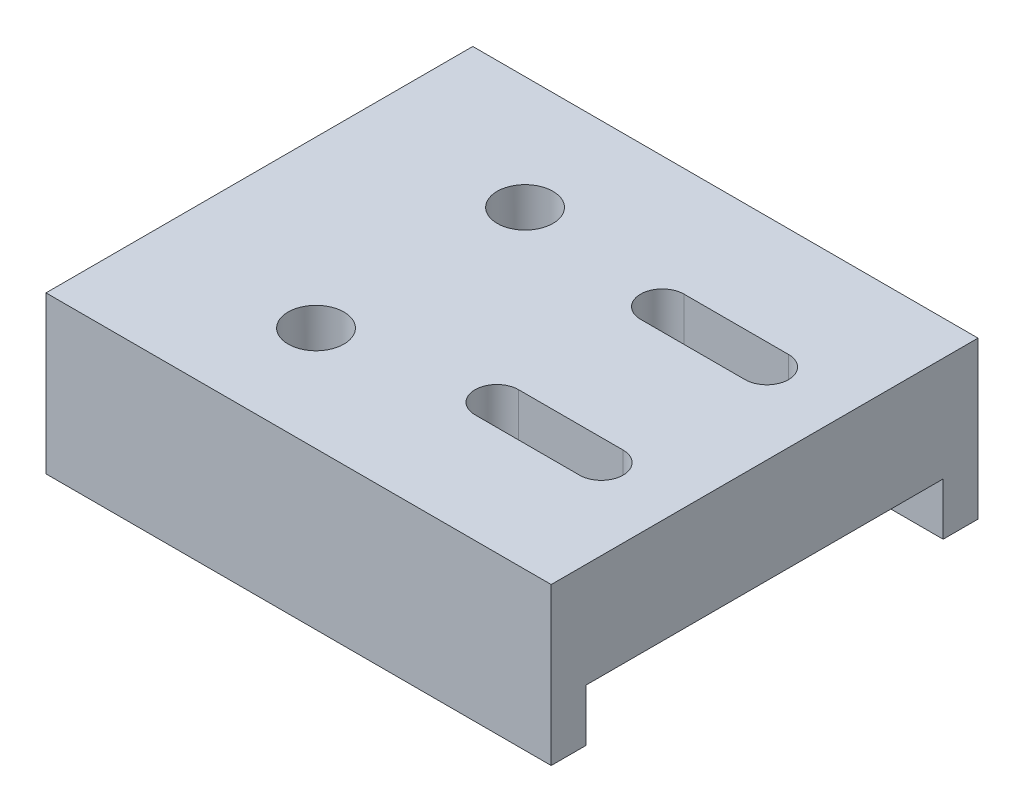
ISO-10303-21;
HEADER;
FILE_DESCRIPTION(('STEP AP214'),'2;1');
FILE_NAME('part.step','',(''),(''),'','','');
FILE_SCHEMA(('AUTOMOTIVE_DESIGN { 1 0 10303 214 1 1 1 1 }'));
ENDSEC;
DATA;
#1=APPLICATION_CONTEXT('core data for automotive mechanical design processes');
#2=APPLICATION_PROTOCOL_DEFINITION('international standard','automotive_design',2000,#1);
#3=PRODUCT_CONTEXT('',#1,'mechanical');
#4=PRODUCT('Part','Part','',(#3));
#5=PRODUCT_RELATED_PRODUCT_CATEGORY('part','',(#4));
#6=PRODUCT_DEFINITION_FORMATION('','',#4);
#7=PRODUCT_DEFINITION_CONTEXT('part definition',#1,'design');
#8=PRODUCT_DEFINITION('design','',#6,#7);
#9=PRODUCT_DEFINITION_SHAPE('','',#8);
#10=(LENGTH_UNIT() NAMED_UNIT(*) SI_UNIT(.MILLI.,.METRE.));
#11=(NAMED_UNIT(*) PLANE_ANGLE_UNIT() SI_UNIT($,.RADIAN.));
#12=(NAMED_UNIT(*) SI_UNIT($,.STERADIAN.) SOLID_ANGLE_UNIT());
#13=UNCERTAINTY_MEASURE_WITH_UNIT(LENGTH_MEASURE(1.E-05),#10,'distance_accuracy_value','');
#14=(GEOMETRIC_REPRESENTATION_CONTEXT(3) GLOBAL_UNCERTAINTY_ASSIGNED_CONTEXT((#13)) GLOBAL_UNIT_ASSIGNED_CONTEXT((#10,
#11,#12)) REPRESENTATION_CONTEXT('',''));
#15=CARTESIAN_POINT('',(0.,0.,0.));
#16=DIRECTION('',(0.,0.,1.));
#17=DIRECTION('',(1.,0.,0.));
#18=AXIS2_PLACEMENT_3D('',#15,#16,#17);
#19=CARTESIAN_POINT('',(14.8770461932741,0.,-7.49999999999982));
#20=DIRECTION('',(0.,-1.,0.));
#21=DIRECTION('',(0.,0.,-1.));
#22=AXIS2_PLACEMENT_3D('',#19,#20,#21);
#23=CYLINDRICAL_SURFACE('',#22,1.25);
#24=DIRECTION('',(0.,-1.,0.));
#25=VECTOR('',#24,1.);
#26=CARTESIAN_POINT('',(14.8770461932741,0.,-8.74999999999982));
#27=LINE('',#26,#25);
#28=CARTESIAN_POINT('',(14.8770461932741,0.,-8.74999999999982));
#29=VERTEX_POINT('',#28);
#30=CARTESIAN_POINT('',(14.8770461932741,-6.,-8.74999999999982));
#31=VERTEX_POINT('',#30);
#32=EDGE_CURVE('E177',#29,#31,#27,.T.);
#33=ORIENTED_EDGE('',*,*,#32,.T.);
#34=CARTESIAN_POINT('',(14.8770461932741,-6.,-7.49999999999982));
#35=DIRECTION('',(0.,-1.,0.));
#36=DIRECTION('',(0.,0.,-1.));
#37=AXIS2_PLACEMENT_3D('',#34,#35,#36);
#38=CIRCLE('',#37,1.25);
#39=CARTESIAN_POINT('',(14.8770461932741,-6.,-6.24999999999981));
#40=VERTEX_POINT('',#39);
#41=EDGE_CURVE('E180',#31,#40,#38,.T.);
#42=ORIENTED_EDGE('',*,*,#41,.T.);
#43=DIRECTION('',(0.,-1.,0.));
#44=VECTOR('',#43,1.);
#45=CARTESIAN_POINT('',(14.8770461932741,0.,-6.24999999999981));
#46=LINE('',#45,#44);
#47=CARTESIAN_POINT('',(14.8770461932741,0.,-6.24999999999981));
#48=VERTEX_POINT('',#47);
#49=EDGE_CURVE('E153',#48,#40,#46,.T.);
#50=ORIENTED_EDGE('',*,*,#49,.F.);
#51=CARTESIAN_POINT('',(14.8770461932741,0.,-7.49999999999982));
#52=DIRECTION('',(0.,-1.,0.));
#53=DIRECTION('',(0.,0.,-1.));
#54=AXIS2_PLACEMENT_3D('',#51,#52,#53);
#55=CIRCLE('',#54,1.25);
#56=EDGE_CURVE('E167',#29,#48,#55,.T.);
#57=ORIENTED_EDGE('',*,*,#56,.F.);
#58=EDGE_LOOP('',(#33,#42,#50,#57));
#59=FACE_BOUND('',#58,.T.);
#60=ADVANCED_FACE('F32',(#59),#23,.F.);
#61=CARTESIAN_POINT('',(14.8770461932741,0.,-16.9999999999998));
#62=DIRECTION('',(0.,-1.,0.));
#63=DIRECTION('',(0.,0.,-1.));
#64=AXIS2_PLACEMENT_3D('',#61,#62,#63);
#65=CYLINDRICAL_SURFACE('',#64,1.25);
#66=DIRECTION('',(0.,-1.,0.));
#67=VECTOR('',#66,1.);
#68=CARTESIAN_POINT('',(14.8770461932741,0.,-18.2499999999998));
#69=LINE('',#68,#67);
#70=CARTESIAN_POINT('',(14.8770461932741,0.,-18.2499999999998));
#71=VERTEX_POINT('',#70);
#72=CARTESIAN_POINT('',(14.8770461932741,-6.,-18.2499999999998));
#73=VERTEX_POINT('',#72);
#74=EDGE_CURVE('E175',#71,#73,#69,.T.);
#75=ORIENTED_EDGE('',*,*,#74,.T.);
#76=CARTESIAN_POINT('',(14.8770461932741,-6.,-16.9999999999998));
#77=DIRECTION('',(0.,-1.,0.));
#78=DIRECTION('',(0.,0.,-1.));
#79=AXIS2_PLACEMENT_3D('',#76,#77,#78);
#80=CIRCLE('',#79,1.25);
#81=CARTESIAN_POINT('',(14.8770461932741,-6.,-15.7499999999998));
#82=VERTEX_POINT('',#81);
#83=EDGE_CURVE('E210',#73,#82,#80,.T.);
#84=ORIENTED_EDGE('',*,*,#83,.T.);
#85=DIRECTION('',(0.,-1.,0.));
#86=VECTOR('',#85,1.);
#87=CARTESIAN_POINT('',(14.8770461932741,0.,-15.7499999999998));
#88=LINE('',#87,#86);
#89=CARTESIAN_POINT('',(14.8770461932741,0.,-15.7499999999998));
#90=VERTEX_POINT('',#89);
#91=EDGE_CURVE('E191',#90,#82,#88,.T.);
#92=ORIENTED_EDGE('',*,*,#91,.F.);
#93=CARTESIAN_POINT('',(14.8770461932741,0.,-16.9999999999998));
#94=DIRECTION('',(0.,-1.,0.));
#95=DIRECTION('',(0.,0.,-1.));
#96=AXIS2_PLACEMENT_3D('',#93,#94,#95);
#97=CIRCLE('',#96,1.25);
#98=EDGE_CURVE('E206',#71,#90,#97,.T.);
#99=ORIENTED_EDGE('',*,*,#98,.F.);
#100=EDGE_LOOP('',(#75,#84,#92,#99));
#101=FACE_BOUND('',#100,.T.);
#102=ADVANCED_FACE('F304',(#101),#65,.F.);
#103=CARTESIAN_POINT('',(9.5,-6.,-24.5));
#104=DIRECTION('',(0.,-1.,0.));
#105=DIRECTION('',(0.,0.,-1.));
#106=AXIS2_PLACEMENT_3D('',#103,#104,#105);
#107=PLANE('',#106);
#108=DIRECTION('',(1.,0.,0.));
#109=VECTOR('',#108,1.);
#110=CARTESIAN_POINT('',(14.8770461932741,-6.,-8.74999999999982));
#111=LINE('',#110,#109);
#112=CARTESIAN_POINT('',(8.87704619327413,-6.,-8.74999999999982));
#113=VERTEX_POINT('',#112);
#114=EDGE_CURVE('E168',#113,#31,#111,.T.);
#115=ORIENTED_EDGE('',*,*,#114,.F.);
#116=CARTESIAN_POINT('',(8.87704619327413,-6.,-7.49999999999982));
#117=DIRECTION('',(0.,-1.,0.));
#118=DIRECTION('',(0.,0.,-1.));
#119=AXIS2_PLACEMENT_3D('',#116,#117,#118);
#120=CIRCLE('',#119,1.25);
#121=CARTESIAN_POINT('',(8.87704619327413,-6.,-6.24999999999981));
#122=VERTEX_POINT('',#121);
#123=EDGE_CURVE('E170',#122,#113,#120,.T.);
#124=ORIENTED_EDGE('',*,*,#123,.F.);
#125=DIRECTION('',(-1.,0.,0.));
#126=VECTOR('',#125,1.);
#127=CARTESIAN_POINT('',(14.8770461932741,-6.,-6.24999999999981));
#128=LINE('',#127,#126);
#129=EDGE_CURVE('E148',#40,#122,#128,.T.);
#130=ORIENTED_EDGE('',*,*,#129,.F.);
#131=ORIENTED_EDGE('',*,*,#41,.F.);
#132=EDGE_LOOP('',(#115,#124,#130,#131));
#133=FACE_BOUND('',#132,.T.);
#134=DIRECTION('',(1.,0.,0.));
#135=VECTOR('',#134,1.);
#136=CARTESIAN_POINT('',(14.8770461932741,-6.,-18.2499999999998));
#137=LINE('',#136,#135);
#138=CARTESIAN_POINT('',(8.87704619327412,-6.,-18.2499999999998));
#139=VERTEX_POINT('',#138);
#140=EDGE_CURVE('E185',#139,#73,#137,.T.);
#141=ORIENTED_EDGE('',*,*,#140,.F.);
#142=CARTESIAN_POINT('',(8.87704619327412,-6.,-16.9999999999998));
#143=DIRECTION('',(0.,-1.,0.));
#144=DIRECTION('',(0.,0.,-1.));
#145=AXIS2_PLACEMENT_3D('',#142,#143,#144);
#146=CIRCLE('',#145,1.25);
#147=CARTESIAN_POINT('',(8.87704619327412,-6.,-15.7499999999998));
#148=VERTEX_POINT('',#147);
#149=EDGE_CURVE('E195',#148,#139,#146,.T.);
#150=ORIENTED_EDGE('',*,*,#149,.F.);
#151=DIRECTION('',(-1.,0.,0.));
#152=VECTOR('',#151,1.);
#153=CARTESIAN_POINT('',(14.8770461932741,-6.,-15.7499999999998));
#154=LINE('',#153,#152);
#155=EDGE_CURVE('E192',#82,#148,#154,.T.);
#156=ORIENTED_EDGE('',*,*,#155,.F.);
#157=ORIENTED_EDGE('',*,*,#83,.F.);
#158=EDGE_LOOP('',(#141,#150,#156,#157));
#159=FACE_BOUND('',#158,.T.);
#160=CARTESIAN_POINT('',(0.,-6.,-6.00000000000005));
#161=DIRECTION('',(0.,-1.,0.));
#162=DIRECTION('',(0.,0.,-1.));
#163=AXIS2_PLACEMENT_3D('',#160,#161,#162);
#164=CIRCLE('',#163,3.1);
#165=CARTESIAN_POINT('',(0.,-6.,-9.10000000000005));
#166=VERTEX_POINT('',#165);
#167=EDGE_CURVE('E36',#166,#166,#164,.T.);
#168=ORIENTED_EDGE('',*,*,#167,.F.);
#169=EDGE_LOOP('',(#168));
#170=FACE_BOUND('',#169,.T.);
#171=CARTESIAN_POINT('',(0.,-6.,-18.));
#172=DIRECTION('',(0.,-1.,0.));
#173=DIRECTION('',(0.,0.,-1.));
#174=AXIS2_PLACEMENT_3D('',#171,#172,#173);
#175=CIRCLE('',#174,3.1);
#176=CARTESIAN_POINT('',(0.,-6.,-21.1));
#177=VERTEX_POINT('',#176);
#178=EDGE_CURVE('E279',#177,#177,#175,.T.);
#179=ORIENTED_EDGE('',*,*,#178,.F.);
#180=EDGE_LOOP('',(#179));
#181=FACE_BOUND('',#180,.T.);
#182=DIRECTION('',(0.,0.,1.));
#183=VECTOR('',#182,1.);
#184=CARTESIAN_POINT('',(-9.5,-6.,-24.5));
#185=LINE('',#184,#183);
#186=CARTESIAN_POINT('',(-9.5,-6.,-22.5));
#187=VERTEX_POINT('',#186);
#188=CARTESIAN_POINT('',(-9.5,-6.,-2.00000000000002));
#189=VERTEX_POINT('',#188);
#190=EDGE_CURVE('E281',#187,#189,#185,.T.);
#191=ORIENTED_EDGE('',*,*,#190,.F.);
#192=DIRECTION('',(-1.,0.,0.));
#193=VECTOR('',#192,1.);
#194=CARTESIAN_POINT('',(-9.5,-6.,-22.5));
#195=LINE('',#194,#193);
#196=CARTESIAN_POINT('',(19.5,-6.,-22.5));
#197=VERTEX_POINT('',#196);
#198=EDGE_CURVE('E246',#197,#187,#195,.T.);
#199=ORIENTED_EDGE('',*,*,#198,.F.);
#200=DIRECTION('',(0.,0.,-1.));
#201=VECTOR('',#200,1.);
#202=CARTESIAN_POINT('',(19.5,-6.,-2.00000000000002));
#203=LINE('',#202,#201);
#204=CARTESIAN_POINT('',(19.5,-6.,-2.00000000000002));
#205=VERTEX_POINT('',#204);
#206=EDGE_CURVE('E234',#205,#197,#203,.T.);
#207=ORIENTED_EDGE('',*,*,#206,.F.);
#208=DIRECTION('',(1.,0.,0.));
#209=VECTOR('',#208,1.);
#210=CARTESIAN_POINT('',(-9.5,-6.,-2.00000000000002));
#211=LINE('',#210,#209);
#212=EDGE_CURVE('E258',#189,#205,#211,.T.);
#213=ORIENTED_EDGE('',*,*,#212,.F.);
#214=EDGE_LOOP('',(#191,#199,#207,#213));
#215=FACE_BOUND('',#214,.T.);
#216=ADVANCED_FACE('F301',(#133,#159,#170,#181,#215),#107,.T.);
#217=CARTESIAN_POINT('',(9.5,0.,0.));
#218=DIRECTION('',(0.,0.,-1.));
#219=DIRECTION('',(0.,1.,0.));
#220=AXIS2_PLACEMENT_3D('',#217,#218,#219);
#221=PLANE('',#220);
#222=DIRECTION('',(0.,-1.,0.));
#223=VECTOR('',#222,1.);
#224=CARTESIAN_POINT('',(-9.5,0.,0.));
#225=LINE('',#224,#223);
#226=CARTESIAN_POINT('',(-9.5,0.,0.));
#227=VERTEX_POINT('',#226);
#228=CARTESIAN_POINT('',(-9.5,-9.,0.));
#229=VERTEX_POINT('',#228);
#230=EDGE_CURVE('E278',#227,#229,#225,.T.);
#231=ORIENTED_EDGE('',*,*,#230,.T.);
#232=DIRECTION('',(-1.,0.,0.));
#233=VECTOR('',#232,1.);
#234=CARTESIAN_POINT('',(-9.5,-9.,0.));
#235=LINE('',#234,#233);
#236=CARTESIAN_POINT('',(19.5,-9.,0.));
#237=VERTEX_POINT('',#236);
#238=EDGE_CURVE('E264',#237,#229,#235,.T.);
#239=ORIENTED_EDGE('',*,*,#238,.F.);
#240=DIRECTION('',(0.,-1.,0.));
#241=VECTOR('',#240,1.);
#242=CARTESIAN_POINT('',(19.5,0.,0.));
#243=LINE('',#242,#241);
#244=CARTESIAN_POINT('',(19.5,0.,0.));
#245=VERTEX_POINT('',#244);
#246=EDGE_CURVE('E225',#245,#237,#243,.T.);
#247=ORIENTED_EDGE('',*,*,#246,.F.);
#248=DIRECTION('',(-1.,0.,0.));
#249=VECTOR('',#248,1.);
#250=CARTESIAN_POINT('',(9.5,0.,0.));
#251=LINE('',#250,#249);
#252=EDGE_CURVE('E41',#245,#227,#251,.T.);
#253=ORIENTED_EDGE('',*,*,#252,.T.);
#254=EDGE_LOOP('',(#231,#239,#247,#253));
#255=FACE_BOUND('',#254,.T.);
#256=ADVANCED_FACE('F34',(#255),#221,.F.);
#257=CARTESIAN_POINT('',(9.5,0.,-24.5));
#258=DIRECTION('',(0.,0.,-1.));
#259=DIRECTION('',(-1.,0.,0.));
#260=AXIS2_PLACEMENT_3D('',#257,#258,#259);
#261=PLANE('',#260);
#262=DIRECTION('',(0.,-1.,0.));
#263=VECTOR('',#262,1.);
#264=CARTESIAN_POINT('',(-9.5,0.,-24.5));
#265=LINE('',#264,#263);
#266=CARTESIAN_POINT('',(-9.5,0.,-24.5));
#267=VERTEX_POINT('',#266);
#268=CARTESIAN_POINT('',(-9.5,-9.,-24.5));
#269=VERTEX_POINT('',#268);
#270=EDGE_CURVE('E283',#267,#269,#265,.T.);
#271=ORIENTED_EDGE('',*,*,#270,.F.);
#272=DIRECTION('',(-1.,0.,0.));
#273=VECTOR('',#272,1.);
#274=CARTESIAN_POINT('',(9.5,0.,-24.5));
#275=LINE('',#274,#273);
#276=CARTESIAN_POINT('',(19.5,0.,-24.5));
#277=VERTEX_POINT('',#276);
#278=EDGE_CURVE('E11',#277,#267,#275,.T.);
#279=ORIENTED_EDGE('',*,*,#278,.F.);
#280=DIRECTION('',(0.,1.,0.));
#281=VECTOR('',#280,1.);
#282=CARTESIAN_POINT('',(19.5,-9.,-24.5));
#283=LINE('',#282,#281);
#284=CARTESIAN_POINT('',(19.5,-9.,-24.5));
#285=VERTEX_POINT('',#284);
#286=EDGE_CURVE('E243',#285,#277,#283,.T.);
#287=ORIENTED_EDGE('',*,*,#286,.F.);
#288=DIRECTION('',(1.,0.,0.));
#289=VECTOR('',#288,1.);
#290=CARTESIAN_POINT('',(-9.5,-9.,-24.5));
#291=LINE('',#290,#289);
#292=EDGE_CURVE('E250',#269,#285,#291,.T.);
#293=ORIENTED_EDGE('',*,*,#292,.F.);
#294=EDGE_LOOP('',(#271,#279,#287,#293));
#295=FACE_BOUND('',#294,.T.);
#296=ADVANCED_FACE('F329',(#295),#261,.T.);
#297=CARTESIAN_POINT('',(9.5,0.,-24.5));
#298=DIRECTION('',(0.,-1.,0.));
#299=DIRECTION('',(0.,0.,-1.));
#300=AXIS2_PLACEMENT_3D('',#297,#298,#299);
#301=PLANE('',#300);
#302=CARTESIAN_POINT('',(8.87704619327412,0.,-16.9999999999998));
#303=DIRECTION('',(0.,-1.,0.));
#304=DIRECTION('',(0.,0.,-1.));
#305=AXIS2_PLACEMENT_3D('',#302,#303,#304);
#306=CIRCLE('',#305,1.25);
#307=CARTESIAN_POINT('',(8.87704619327412,0.,-15.7499999999998));
#308=VERTEX_POINT('',#307);
#309=CARTESIAN_POINT('',(8.87704619327412,0.,-18.2499999999998));
#310=VERTEX_POINT('',#309);
#311=EDGE_CURVE('E184',#308,#310,#306,.T.);
#312=ORIENTED_EDGE('',*,*,#311,.T.);
#313=DIRECTION('',(1.,0.,0.));
#314=VECTOR('',#313,1.);
#315=CARTESIAN_POINT('',(14.8770461932741,0.,-18.2499999999998));
#316=LINE('',#315,#314);
#317=EDGE_CURVE('E188',#310,#71,#316,.T.);
#318=ORIENTED_EDGE('',*,*,#317,.T.);
#319=ORIENTED_EDGE('',*,*,#98,.T.);
#320=DIRECTION('',(-1.,0.,0.));
#321=VECTOR('',#320,1.);
#322=CARTESIAN_POINT('',(14.8770461932741,0.,-15.7499999999998));
#323=LINE('',#322,#321);
#324=EDGE_CURVE('E57',#90,#308,#323,.T.);
#325=ORIENTED_EDGE('',*,*,#324,.T.);
#326=EDGE_LOOP('',(#312,#318,#319,#325));
#327=FACE_BOUND('',#326,.T.);
#328=CARTESIAN_POINT('',(8.87704619327413,0.,-7.49999999999982));
#329=DIRECTION('',(0.,-1.,0.));
#330=DIRECTION('',(0.,0.,-1.));
#331=AXIS2_PLACEMENT_3D('',#328,#329,#330);
#332=CIRCLE('',#331,1.25);
#333=CARTESIAN_POINT('',(8.87704619327413,0.,-6.24999999999981));
#334=VERTEX_POINT('',#333);
#335=CARTESIAN_POINT('',(8.87704619327413,0.,-8.74999999999982));
#336=VERTEX_POINT('',#335);
#337=EDGE_CURVE('E156',#334,#336,#332,.T.);
#338=ORIENTED_EDGE('',*,*,#337,.T.);
#339=DIRECTION('',(1.,0.,0.));
#340=VECTOR('',#339,1.);
#341=CARTESIAN_POINT('',(14.8770461932741,0.,-8.74999999999982));
#342=LINE('',#341,#340);
#343=EDGE_CURVE('E161',#336,#29,#342,.T.);
#344=ORIENTED_EDGE('',*,*,#343,.T.);
#345=ORIENTED_EDGE('',*,*,#56,.T.);
#346=DIRECTION('',(-1.,0.,0.));
#347=VECTOR('',#346,1.);
#348=CARTESIAN_POINT('',(14.8770461932741,0.,-6.24999999999981));
#349=LINE('',#348,#347);
#350=EDGE_CURVE('E49',#48,#334,#349,.T.);
#351=ORIENTED_EDGE('',*,*,#350,.T.);
#352=EDGE_LOOP('',(#338,#344,#345,#351));
#353=FACE_BOUND('',#352,.T.);
#354=CARTESIAN_POINT('',(0.,0.,-6.00000000000005));
#355=DIRECTION('',(0.,1.,0.));
#356=DIRECTION('',(0.,0.,-1.));
#357=AXIS2_PLACEMENT_3D('',#354,#355,#356);
#358=CIRCLE('',#357,1.6);
#359=CARTESIAN_POINT('',(0.,0.,-7.60000000000006));
#360=VERTEX_POINT('',#359);
#361=EDGE_CURVE('E219',#360,#360,#358,.T.);
#362=ORIENTED_EDGE('',*,*,#361,.F.);
#363=EDGE_LOOP('',(#362));
#364=FACE_BOUND('',#363,.T.);
#365=CARTESIAN_POINT('',(0.,0.,-18.0000000000001));
#366=DIRECTION('',(0.,1.,0.));
#367=DIRECTION('',(0.,0.,-1.));
#368=AXIS2_PLACEMENT_3D('',#365,#366,#367);
#369=CIRCLE('',#368,1.6);
#370=CARTESIAN_POINT('',(0.,0.,-19.6000000000001));
#371=VERTEX_POINT('',#370);
#372=EDGE_CURVE('E275',#371,#371,#369,.T.);
#373=ORIENTED_EDGE('',*,*,#372,.F.);
#374=EDGE_LOOP('',(#373));
#375=FACE_BOUND('',#374,.T.);
#376=DIRECTION('',(0.,0.,1.));
#377=VECTOR('',#376,1.);
#378=CARTESIAN_POINT('',(-9.5,0.,-24.5));
#379=LINE('',#378,#377);
#380=EDGE_CURVE('E285',#267,#227,#379,.T.);
#381=ORIENTED_EDGE('',*,*,#380,.T.);
#382=ORIENTED_EDGE('',*,*,#252,.F.);
#383=DIRECTION('',(0.,0.,1.));
#384=VECTOR('',#383,1.);
#385=CARTESIAN_POINT('',(19.5,0.,-24.5));
#386=LINE('',#385,#384);
#387=EDGE_CURVE('E222',#277,#245,#386,.T.);
#388=ORIENTED_EDGE('',*,*,#387,.F.);
#389=ORIENTED_EDGE('',*,*,#278,.T.);
#390=EDGE_LOOP('',(#381,#382,#388,#389));
#391=FACE_BOUND('',#390,.T.);
#392=ADVANCED_FACE('F164',(#327,#353,#364,#375,#391),#301,.F.);
#393=CARTESIAN_POINT('',(-9.5,0.,0.));
#394=DIRECTION('',(-1.,0.,0.));
#395=DIRECTION('',(0.,0.,1.));
#396=AXIS2_PLACEMENT_3D('',#393,#394,#395);
#397=PLANE('',#396);
#398=ORIENTED_EDGE('',*,*,#270,.T.);
#399=DIRECTION('',(0.,0.,-1.));
#400=VECTOR('',#399,1.);
#401=CARTESIAN_POINT('',(-9.5,-9.,-24.5));
#402=LINE('',#401,#400);
#403=CARTESIAN_POINT('',(-9.5,-9.,-22.5));
#404=VERTEX_POINT('',#403);
#405=EDGE_CURVE('E247',#404,#269,#402,.T.);
#406=ORIENTED_EDGE('',*,*,#405,.F.);
#407=DIRECTION('',(0.,1.,0.));
#408=VECTOR('',#407,1.);
#409=CARTESIAN_POINT('',(-9.5,-9.,-22.5));
#410=LINE('',#409,#408);
#411=EDGE_CURVE('E254',#404,#187,#410,.T.);
#412=ORIENTED_EDGE('',*,*,#411,.T.);
#413=ORIENTED_EDGE('',*,*,#190,.T.);
#414=DIRECTION('',(0.,1.,0.));
#415=VECTOR('',#414,1.);
#416=CARTESIAN_POINT('',(-9.5,-9.,-2.00000000000002));
#417=LINE('',#416,#415);
#418=CARTESIAN_POINT('',(-9.5,-9.,-2.00000000000002));
#419=VERTEX_POINT('',#418);
#420=EDGE_CURVE('E267',#419,#189,#417,.T.);
#421=ORIENTED_EDGE('',*,*,#420,.F.);
#422=DIRECTION('',(0.,0.,-1.));
#423=VECTOR('',#422,1.);
#424=CARTESIAN_POINT('',(-9.5,-9.,0.));
#425=LINE('',#424,#423);
#426=EDGE_CURVE('E259',#229,#419,#425,.T.);
#427=ORIENTED_EDGE('',*,*,#426,.F.);
#428=ORIENTED_EDGE('',*,*,#230,.F.);
#429=ORIENTED_EDGE('',*,*,#380,.F.);
#430=EDGE_LOOP('',(#398,#406,#412,#413,#421,#427,#428,#429));
#431=FACE_BOUND('',#430,.T.);
#432=ADVANCED_FACE('F313',(#431),#397,.T.);
#433=CARTESIAN_POINT('',(0.,-14.,-18.));
#434=DIRECTION('',(0.,1.,0.));
#435=DIRECTION('',(0.,0.,1.));
#436=AXIS2_PLACEMENT_3D('',#433,#434,#435);
#437=CYLINDRICAL_SURFACE('',#436,1.6);
#438=CARTESIAN_POINT('',(0.,-2.5,-18.0000000000001));
#439=DIRECTION('',(0.,1.,0.));
#440=DIRECTION('',(0.,0.,1.));
#441=AXIS2_PLACEMENT_3D('',#438,#439,#440);
#442=CIRCLE('',#441,1.6);
#443=CARTESIAN_POINT('',(0.,-2.5,-16.4000000000001));
#444=VERTEX_POINT('',#443);
#445=EDGE_CURVE('E274',#444,#444,#442,.F.);
#446=ORIENTED_EDGE('',*,*,#445,.T.);
#447=EDGE_LOOP('',(#446));
#448=FACE_BOUND('',#447,.T.);
#449=ORIENTED_EDGE('',*,*,#372,.T.);
#450=EDGE_LOOP('',(#449));
#451=FACE_BOUND('',#450,.T.);
#452=ADVANCED_FACE('F504',(#448,#451),#437,.F.);
#453=CARTESIAN_POINT('',(0.,-2.5,-18.));
#454=DIRECTION('',(0.,1.,0.));
#455=DIRECTION('',(0.,0.,1.));
#456=AXIS2_PLACEMENT_3D('',#453,#454,#455);
#457=PLANE('',#456);
#458=CARTESIAN_POINT('',(0.,-2.5,-18.));
#459=DIRECTION('',(0.,1.,0.));
#460=DIRECTION('',(0.,0.,1.));
#461=AXIS2_PLACEMENT_3D('',#458,#459,#460);
#462=CIRCLE('',#461,3.1);
#463=CARTESIAN_POINT('',(0.,-2.5,-14.9000000000001));
#464=VERTEX_POINT('',#463);
#465=EDGE_CURVE('E271',#464,#464,#462,.T.);
#466=ORIENTED_EDGE('',*,*,#465,.F.);
#467=EDGE_LOOP('',(#466));
#468=FACE_BOUND('',#467,.T.);
#469=ORIENTED_EDGE('',*,*,#445,.F.);
#470=EDGE_LOOP('',(#469));
#471=FACE_BOUND('',#470,.T.);
#472=ADVANCED_FACE('F350',(#468,#471),#457,.F.);
#473=CARTESIAN_POINT('',(0.,-14.,-18.));
#474=DIRECTION('',(0.,1.,0.));
#475=DIRECTION('',(0.,0.,1.));
#476=AXIS2_PLACEMENT_3D('',#473,#474,#475);
#477=CYLINDRICAL_SURFACE('',#476,3.1);
#478=ORIENTED_EDGE('',*,*,#178,.T.);
#479=EDGE_LOOP('',(#478));
#480=FACE_BOUND('',#479,.T.);
#481=ORIENTED_EDGE('',*,*,#465,.T.);
#482=EDGE_LOOP('',(#481));
#483=FACE_BOUND('',#482,.T.);
#484=ADVANCED_FACE('F343',(#480,#483),#477,.F.);
#485=CARTESIAN_POINT('',(-9.5,-9.,-2.00000000000002));
#486=DIRECTION('',(0.,0.,1.));
#487=DIRECTION('',(0.,-1.,0.));
#488=AXIS2_PLACEMENT_3D('',#485,#486,#487);
#489=PLANE('',#488);
#490=ORIENTED_EDGE('',*,*,#212,.T.);
#491=DIRECTION('',(0.,1.,0.));
#492=VECTOR('',#491,1.);
#493=CARTESIAN_POINT('',(19.5,-9.,-2.00000000000002));
#494=LINE('',#493,#492);
#495=CARTESIAN_POINT('',(19.5,-9.,-2.00000000000002));
#496=VERTEX_POINT('',#495);
#497=EDGE_CURVE('E231',#496,#205,#494,.T.);
#498=ORIENTED_EDGE('',*,*,#497,.F.);
#499=DIRECTION('',(1.,0.,0.));
#500=VECTOR('',#499,1.);
#501=CARTESIAN_POINT('',(-9.5,-9.,-2.00000000000002));
#502=LINE('',#501,#500);
#503=EDGE_CURVE('E262',#419,#496,#502,.T.);
#504=ORIENTED_EDGE('',*,*,#503,.F.);
#505=ORIENTED_EDGE('',*,*,#420,.T.);
#506=EDGE_LOOP('',(#490,#498,#504,#505));
#507=FACE_BOUND('',#506,.T.);
#508=ADVANCED_FACE('F341',(#507),#489,.F.);
#509=CARTESIAN_POINT('',(0.,-9.,0.));
#510=DIRECTION('',(0.,-1.,0.));
#511=DIRECTION('',(0.,0.,-1.));
#512=AXIS2_PLACEMENT_3D('',#509,#510,#511);
#513=PLANE('',#512);
#514=ORIENTED_EDGE('',*,*,#426,.T.);
#515=ORIENTED_EDGE('',*,*,#503,.T.);
#516=DIRECTION('',(0.,0.,-1.));
#517=VECTOR('',#516,1.);
#518=CARTESIAN_POINT('',(19.5,-9.,0.));
#519=LINE('',#518,#517);
#520=EDGE_CURVE('E228',#237,#496,#519,.T.);
#521=ORIENTED_EDGE('',*,*,#520,.F.);
#522=ORIENTED_EDGE('',*,*,#238,.T.);
#523=EDGE_LOOP('',(#514,#515,#521,#522));
#524=FACE_BOUND('',#523,.T.);
#525=ADVANCED_FACE('F339',(#524),#513,.T.);
#526=CARTESIAN_POINT('',(-9.5,-9.,-22.5));
#527=DIRECTION('',(0.,0.,-1.));
#528=DIRECTION('',(0.,1.,0.));
#529=AXIS2_PLACEMENT_3D('',#526,#527,#528);
#530=PLANE('',#529);
#531=ORIENTED_EDGE('',*,*,#198,.T.);
#532=ORIENTED_EDGE('',*,*,#411,.F.);
#533=DIRECTION('',(-1.,0.,0.));
#534=VECTOR('',#533,1.);
#535=CARTESIAN_POINT('',(-9.5,-9.,-22.5));
#536=LINE('',#535,#534);
#537=CARTESIAN_POINT('',(19.5,-9.,-22.5));
#538=VERTEX_POINT('',#537);
#539=EDGE_CURVE('E252',#538,#404,#536,.T.);
#540=ORIENTED_EDGE('',*,*,#539,.F.);
#541=DIRECTION('',(0.,-1.,0.));
#542=VECTOR('',#541,1.);
#543=CARTESIAN_POINT('',(19.5,-6.,-22.5));
#544=LINE('',#543,#542);
#545=EDGE_CURVE('E237',#197,#538,#544,.T.);
#546=ORIENTED_EDGE('',*,*,#545,.F.);
#547=EDGE_LOOP('',(#531,#532,#540,#546));
#548=FACE_BOUND('',#547,.T.);
#549=ADVANCED_FACE('F319',(#548),#530,.F.);
#550=CARTESIAN_POINT('',(0.,-9.,0.));
#551=DIRECTION('',(0.,1.,0.));
#552=DIRECTION('',(0.,0.,1.));
#553=AXIS2_PLACEMENT_3D('',#550,#551,#552);
#554=PLANE('',#553);
#555=ORIENTED_EDGE('',*,*,#405,.T.);
#556=ORIENTED_EDGE('',*,*,#292,.T.);
#557=DIRECTION('',(0.,0.,-1.));
#558=VECTOR('',#557,1.);
#559=CARTESIAN_POINT('',(19.5,-9.,-22.5));
#560=LINE('',#559,#558);
#561=EDGE_CURVE('E240',#538,#285,#560,.T.);
#562=ORIENTED_EDGE('',*,*,#561,.F.);
#563=ORIENTED_EDGE('',*,*,#539,.T.);
#564=EDGE_LOOP('',(#555,#556,#562,#563));
#565=FACE_BOUND('',#564,.T.);
#566=ADVANCED_FACE('F325',(#565),#554,.F.);
#567=CARTESIAN_POINT('',(19.5,0.,0.));
#568=DIRECTION('',(1.,0.,0.));
#569=DIRECTION('',(0.,0.,-1.));
#570=AXIS2_PLACEMENT_3D('',#567,#568,#569);
#571=PLANE('',#570);
#572=ORIENTED_EDGE('',*,*,#387,.T.);
#573=ORIENTED_EDGE('',*,*,#246,.T.);
#574=ORIENTED_EDGE('',*,*,#520,.T.);
#575=ORIENTED_EDGE('',*,*,#497,.T.);
#576=ORIENTED_EDGE('',*,*,#206,.T.);
#577=ORIENTED_EDGE('',*,*,#545,.T.);
#578=ORIENTED_EDGE('',*,*,#561,.T.);
#579=ORIENTED_EDGE('',*,*,#286,.T.);
#580=EDGE_LOOP('',(#572,#573,#574,#575,#576,#577,#578,#579));
#581=FACE_BOUND('',#580,.T.);
#582=ADVANCED_FACE('F322',(#581),#571,.T.);
#583=CARTESIAN_POINT('',(0.,-9.,-6.00000000000005));
#584=DIRECTION('',(0.,1.,0.));
#585=DIRECTION('',(0.,0.,1.));
#586=AXIS2_PLACEMENT_3D('',#583,#584,#585);
#587=CYLINDRICAL_SURFACE('',#586,1.6);
#588=CARTESIAN_POINT('',(0.,-2.5,-6.00000000000005));
#589=DIRECTION('',(0.,1.,0.));
#590=DIRECTION('',(0.,0.,1.));
#591=AXIS2_PLACEMENT_3D('',#588,#589,#590);
#592=CIRCLE('',#591,1.6);
#593=CARTESIAN_POINT('',(0.,-2.5,-4.40000000000005));
#594=VERTEX_POINT('',#593);
#595=EDGE_CURVE('E218',#594,#594,#592,.F.);
#596=ORIENTED_EDGE('',*,*,#595,.T.);
#597=EDGE_LOOP('',(#596));
#598=FACE_BOUND('',#597,.T.);
#599=ORIENTED_EDGE('',*,*,#361,.T.);
#600=EDGE_LOOP('',(#599));
#601=FACE_BOUND('',#600,.T.);
#602=ADVANCED_FACE('F368',(#598,#601),#587,.F.);
#603=CARTESIAN_POINT('',(0.,-2.5,-6.00000000000005));
#604=DIRECTION('',(0.,1.,0.));
#605=DIRECTION('',(0.,0.,1.));
#606=AXIS2_PLACEMENT_3D('',#603,#604,#605);
#607=PLANE('',#606);
#608=CARTESIAN_POINT('',(0.,-2.5,-6.00000000000005));
#609=DIRECTION('',(0.,1.,0.));
#610=DIRECTION('',(0.,0.,1.));
#611=AXIS2_PLACEMENT_3D('',#608,#609,#610);
#612=CIRCLE('',#611,3.1);
#613=CARTESIAN_POINT('',(0.,-2.5,-2.90000000000005));
#614=VERTEX_POINT('',#613);
#615=EDGE_CURVE('E209',#614,#614,#612,.T.);
#616=ORIENTED_EDGE('',*,*,#615,.F.);
#617=EDGE_LOOP('',(#616));
#618=FACE_BOUND('',#617,.T.);
#619=ORIENTED_EDGE('',*,*,#595,.F.);
#620=EDGE_LOOP('',(#619));
#621=FACE_BOUND('',#620,.T.);
#622=ADVANCED_FACE('F365',(#618,#621),#607,.F.);
#623=CARTESIAN_POINT('',(0.,-9.,-6.00000000000005));
#624=DIRECTION('',(0.,1.,0.));
#625=DIRECTION('',(0.,0.,1.));
#626=AXIS2_PLACEMENT_3D('',#623,#624,#625);
#627=CYLINDRICAL_SURFACE('',#626,3.1);
#628=ORIENTED_EDGE('',*,*,#167,.T.);
#629=EDGE_LOOP('',(#628));
#630=FACE_BOUND('',#629,.T.);
#631=ORIENTED_EDGE('',*,*,#615,.T.);
#632=EDGE_LOOP('',(#631));
#633=FACE_BOUND('',#632,.T.);
#634=ADVANCED_FACE('F298',(#630,#633),#627,.F.);
#635=CARTESIAN_POINT('',(14.8770461932741,0.,-18.2499999999998));
#636=DIRECTION('',(0.,0.,-1.));
#637=DIRECTION('',(0.,1.,0.));
#638=AXIS2_PLACEMENT_3D('',#635,#636,#637);
#639=PLANE('',#638);
#640=ORIENTED_EDGE('',*,*,#140,.T.);
#641=ORIENTED_EDGE('',*,*,#74,.F.);
#642=ORIENTED_EDGE('',*,*,#317,.F.);
#643=DIRECTION('',(0.,-1.,0.));
#644=VECTOR('',#643,1.);
#645=CARTESIAN_POINT('',(8.87704619327412,0.,-18.2499999999998));
#646=LINE('',#645,#644);
#647=EDGE_CURVE('E201',#310,#139,#646,.T.);
#648=ORIENTED_EDGE('',*,*,#647,.T.);
#649=EDGE_LOOP('',(#640,#641,#642,#648));
#650=FACE_BOUND('',#649,.T.);
#651=ADVANCED_FACE('F371',(#650),#639,.F.);
#652=CARTESIAN_POINT('',(8.87704619327412,0.,-16.9999999999998));
#653=DIRECTION('',(0.,-1.,0.));
#654=DIRECTION('',(0.,0.,-1.));
#655=AXIS2_PLACEMENT_3D('',#652,#653,#654);
#656=CYLINDRICAL_SURFACE('',#655,1.25);
#657=ORIENTED_EDGE('',*,*,#149,.T.);
#658=ORIENTED_EDGE('',*,*,#647,.F.);
#659=ORIENTED_EDGE('',*,*,#311,.F.);
#660=DIRECTION('',(0.,-1.,0.));
#661=VECTOR('',#660,1.);
#662=CARTESIAN_POINT('',(8.87704619327412,0.,-15.7499999999998));
#663=LINE('',#662,#661);
#664=EDGE_CURVE('E203',#308,#148,#663,.T.);
#665=ORIENTED_EDGE('',*,*,#664,.T.);
#666=EDGE_LOOP('',(#657,#658,#659,#665));
#667=FACE_BOUND('',#666,.T.);
#668=ADVANCED_FACE('F436',(#667),#656,.F.);
#669=CARTESIAN_POINT('',(14.8770461932741,0.,-15.7499999999998));
#670=DIRECTION('',(0.,0.,1.));
#671=DIRECTION('',(0.,-1.,0.));
#672=AXIS2_PLACEMENT_3D('',#669,#670,#671);
#673=PLANE('',#672);
#674=ORIENTED_EDGE('',*,*,#155,.T.);
#675=ORIENTED_EDGE('',*,*,#664,.F.);
#676=ORIENTED_EDGE('',*,*,#324,.F.);
#677=ORIENTED_EDGE('',*,*,#91,.T.);
#678=EDGE_LOOP('',(#674,#675,#676,#677));
#679=FACE_BOUND('',#678,.T.);
#680=ADVANCED_FACE('F446',(#679),#673,.F.);
#681=CARTESIAN_POINT('',(14.8770461932741,0.,-8.74999999999982));
#682=DIRECTION('',(0.,0.,-1.));
#683=DIRECTION('',(0.,1.,0.));
#684=AXIS2_PLACEMENT_3D('',#681,#682,#683);
#685=PLANE('',#684);
#686=ORIENTED_EDGE('',*,*,#114,.T.);
#687=ORIENTED_EDGE('',*,*,#32,.F.);
#688=ORIENTED_EDGE('',*,*,#343,.F.);
#689=DIRECTION('',(0.,-1.,0.));
#690=VECTOR('',#689,1.);
#691=CARTESIAN_POINT('',(8.87704619327413,0.,-8.74999999999982));
#692=LINE('',#691,#690);
#693=EDGE_CURVE('E152',#336,#113,#692,.T.);
#694=ORIENTED_EDGE('',*,*,#693,.T.);
#695=EDGE_LOOP('',(#686,#687,#688,#694));
#696=FACE_BOUND('',#695,.T.);
#697=ADVANCED_FACE('F456',(#696),#685,.F.);
#698=CARTESIAN_POINT('',(8.87704619327413,0.,-7.49999999999982));
#699=DIRECTION('',(0.,-1.,0.));
#700=DIRECTION('',(0.,0.,-1.));
#701=AXIS2_PLACEMENT_3D('',#698,#699,#700);
#702=CYLINDRICAL_SURFACE('',#701,1.25);
#703=ORIENTED_EDGE('',*,*,#123,.T.);
#704=ORIENTED_EDGE('',*,*,#693,.F.);
#705=ORIENTED_EDGE('',*,*,#337,.F.);
#706=DIRECTION('',(0.,-1.,0.));
#707=VECTOR('',#706,1.);
#708=CARTESIAN_POINT('',(8.87704619327413,0.,-6.24999999999981));
#709=LINE('',#708,#707);
#710=EDGE_CURVE('E144',#334,#122,#709,.T.);
#711=ORIENTED_EDGE('',*,*,#710,.T.);
#712=EDGE_LOOP('',(#703,#704,#705,#711));
#713=FACE_BOUND('',#712,.T.);
#714=ADVANCED_FACE('F157',(#713),#702,.F.);
#715=CARTESIAN_POINT('',(14.8770461932741,0.,-6.24999999999981));
#716=DIRECTION('',(0.,0.,1.));
#717=DIRECTION('',(1.,0.,0.));
#718=AXIS2_PLACEMENT_3D('',#715,#716,#717);
#719=PLANE('',#718);
#720=ORIENTED_EDGE('',*,*,#129,.T.);
#721=ORIENTED_EDGE('',*,*,#710,.F.);
#722=ORIENTED_EDGE('',*,*,#350,.F.);
#723=ORIENTED_EDGE('',*,*,#49,.T.);
#724=EDGE_LOOP('',(#720,#721,#722,#723));
#725=FACE_BOUND('',#724,.T.);
#726=ADVANCED_FACE('F146',(#725),#719,.F.);
#727=CLOSED_SHELL('',(#60,#102,#216,#256,#296,#392,#432,#452,#472,#484,#508,#525,#549,#566,#582,
#602,#622,#634,#651,#668,#680,#697,#714,#726));
#728=MANIFOLD_SOLID_BREP('B2',#727);
#729=ADVANCED_BREP_SHAPE_REPRESENTATION('',(#18,#728),#14);
#730=SHAPE_DEFINITION_REPRESENTATION(#9,#729);
ENDSEC;
END-ISO-10303-21;
